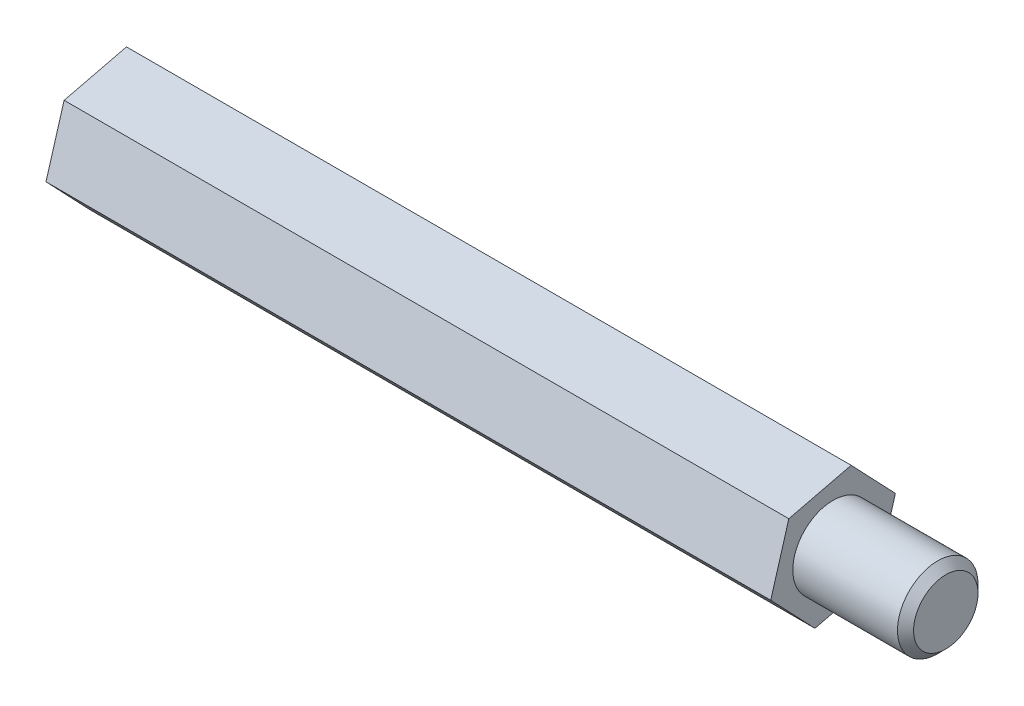
ISO-10303-21;
HEADER;
FILE_DESCRIPTION(('STEP AP214'),'2;1');
FILE_NAME('part.step','',(''),(''),'','','');
FILE_SCHEMA(('AUTOMOTIVE_DESIGN { 1 0 10303 214 1 1 1 1 }'));
ENDSEC;
DATA;
#1=APPLICATION_CONTEXT('core data for automotive mechanical design processes');
#2=APPLICATION_PROTOCOL_DEFINITION('international standard','automotive_design',2000,#1);
#3=PRODUCT_CONTEXT('',#1,'mechanical');
#4=PRODUCT('Part','Part','',(#3));
#5=PRODUCT_RELATED_PRODUCT_CATEGORY('part','',(#4));
#6=PRODUCT_DEFINITION_FORMATION('','',#4);
#7=PRODUCT_DEFINITION_CONTEXT('part definition',#1,'design');
#8=PRODUCT_DEFINITION('design','',#6,#7);
#9=PRODUCT_DEFINITION_SHAPE('','',#8);
#10=(LENGTH_UNIT() NAMED_UNIT(*) SI_UNIT(.MILLI.,.METRE.));
#11=(NAMED_UNIT(*) PLANE_ANGLE_UNIT() SI_UNIT($,.RADIAN.));
#12=(NAMED_UNIT(*) SI_UNIT($,.STERADIAN.) SOLID_ANGLE_UNIT());
#13=UNCERTAINTY_MEASURE_WITH_UNIT(LENGTH_MEASURE(1.E-05),#10,'distance_accuracy_value','');
#14=(GEOMETRIC_REPRESENTATION_CONTEXT(3) GLOBAL_UNCERTAINTY_ASSIGNED_CONTEXT((#13)) GLOBAL_UNIT_ASSIGNED_CONTEXT((#10,
#11,#12)) REPRESENTATION_CONTEXT('',''));
#15=CARTESIAN_POINT('',(0.,0.,0.));
#16=DIRECTION('',(0.,0.,1.));
#17=DIRECTION('',(1.,0.,0.));
#18=AXIS2_PLACEMENT_3D('',#15,#16,#17);
#19=CARTESIAN_POINT('',(45.,-3.82165678707494,1.12469524841357));
#20=DIRECTION('',(0.,0.971956498152784,0.235160723120545));
#21=DIRECTION('',(0.,-0.235160723120545,0.971956498152784));
#22=AXIS2_PLACEMENT_3D('',#19,#20,#21);
#23=PLANE('',#22);
#24=DIRECTION('',(0.,0.235160723120545,-0.971956498152784));
#25=VECTOR('',#24,1.);
#26=CARTESIAN_POINT('',(0.,-3.82165678707494,1.12469524841357));
#27=LINE('',#26,#25);
#28=CARTESIAN_POINT('',(0.,-3.82165678707494,1.12469524841357));
#29=VERTEX_POINT('',#28);
#30=CARTESIAN_POINT('',(0.,-2.88484305017927,-2.74730423794533));
#31=VERTEX_POINT('',#30);
#32=EDGE_CURVE('E124',#29,#31,#27,.T.);
#33=ORIENTED_EDGE('',*,*,#32,.T.);
#34=DIRECTION('',(-1.,0.,0.));
#35=VECTOR('',#34,1.);
#36=CARTESIAN_POINT('',(45.,-2.88484305017927,-2.74730423794533));
#37=LINE('',#36,#35);
#38=CARTESIAN_POINT('',(45.,-2.88484305017927,-2.74730423794533));
#39=VERTEX_POINT('',#38);
#40=EDGE_CURVE('E142',#39,#31,#37,.T.);
#41=ORIENTED_EDGE('',*,*,#40,.F.);
#42=DIRECTION('',(0.,0.235160723120545,-0.971956498152784));
#43=VECTOR('',#42,1.);
#44=CARTESIAN_POINT('',(45.,-3.82165678707494,1.12469524841357));
#45=LINE('',#44,#43);
#46=CARTESIAN_POINT('',(45.,-3.82165678707494,1.12469524841357));
#47=VERTEX_POINT('',#46);
#48=EDGE_CURVE('E135',#47,#39,#45,.T.);
#49=ORIENTED_EDGE('',*,*,#48,.F.);
#50=DIRECTION('',(-1.,0.,0.));
#51=VECTOR('',#50,1.);
#52=CARTESIAN_POINT('',(45.,-3.82165678707494,1.12469524841357));
#53=LINE('',#52,#51);
#54=EDGE_CURVE('E120',#47,#29,#53,.T.);
#55=ORIENTED_EDGE('',*,*,#54,.T.);
#56=EDGE_LOOP('',(#33,#41,#49,#55));
#57=FACE_BOUND('',#56,.T.);
#58=ADVANCED_FACE('F37',(#57),#23,.F.);
#59=CARTESIAN_POINT('',(45.,-2.88484305017927,-2.74730423794533));
#60=DIRECTION('',(0.,0.282323088881682,0.959319380333946));
#61=DIRECTION('',(0.,-0.959319380333946,0.282323088881682));
#62=AXIS2_PLACEMENT_3D('',#59,#60,#61);
#63=PLANE('',#62);
#64=DIRECTION('',(0.,0.959319380333946,-0.282323088881682));
#65=VECTOR('',#64,1.);
#66=CARTESIAN_POINT('',(0.,-2.88484305017927,-2.74730423794533));
#67=LINE('',#66,#65);
#68=CARTESIAN_POINT('',(0.,0.936813736895666,-3.8719994863589));
#69=VERTEX_POINT('',#68);
#70=EDGE_CURVE('E127',#31,#69,#67,.T.);
#71=ORIENTED_EDGE('',*,*,#70,.T.);
#72=DIRECTION('',(-1.,0.,0.));
#73=VECTOR('',#72,1.);
#74=CARTESIAN_POINT('',(45.,0.936813736895666,-3.8719994863589));
#75=LINE('',#74,#73);
#76=CARTESIAN_POINT('',(45.,0.936813736895666,-3.8719994863589));
#77=VERTEX_POINT('',#76);
#78=EDGE_CURVE('E139',#77,#69,#75,.T.);
#79=ORIENTED_EDGE('',*,*,#78,.F.);
#80=DIRECTION('',(0.,0.959319380333946,-0.282323088881682));
#81=VECTOR('',#80,1.);
#82=CARTESIAN_POINT('',(45.,-2.88484305017927,-2.74730423794533));
#83=LINE('',#82,#81);
#84=EDGE_CURVE('E93',#39,#77,#83,.T.);
#85=ORIENTED_EDGE('',*,*,#84,.F.);
#86=ORIENTED_EDGE('',*,*,#40,.T.);
#87=EDGE_LOOP('',(#71,#79,#85,#86));
#88=FACE_BOUND('',#87,.T.);
#89=ADVANCED_FACE('F158',(#88),#63,.F.);
#90=CARTESIAN_POINT('',(45.,0.936813736895666,-3.8719994863589));
#91=DIRECTION('',(0.,-0.689633409271102,0.724158657213402));
#92=DIRECTION('',(0.,-0.724158657213402,-0.689633409271102));
#93=AXIS2_PLACEMENT_3D('',#90,#91,#92);
#94=PLANE('',#93);
#95=DIRECTION('',(0.,0.724158657213402,0.689633409271102));
#96=VECTOR('',#95,1.);
#97=CARTESIAN_POINT('',(0.,0.936813736895666,-3.8719994863589));
#98=LINE('',#97,#96);
#99=CARTESIAN_POINT('',(0.,3.82165678707494,-1.12469524841357));
#100=VERTEX_POINT('',#99);
#101=EDGE_CURVE('E130',#69,#100,#98,.T.);
#102=ORIENTED_EDGE('',*,*,#101,.T.);
#103=DIRECTION('',(-1.,0.,0.));
#104=VECTOR('',#103,1.);
#105=CARTESIAN_POINT('',(45.,3.82165678707494,-1.12469524841357));
#106=LINE('',#105,#104);
#107=CARTESIAN_POINT('',(45.,3.82165678707494,-1.12469524841357));
#108=VERTEX_POINT('',#107);
#109=EDGE_CURVE('E115',#108,#100,#106,.T.);
#110=ORIENTED_EDGE('',*,*,#109,.F.);
#111=DIRECTION('',(0.,0.724158657213402,0.689633409271102));
#112=VECTOR('',#111,1.);
#113=CARTESIAN_POINT('',(45.,0.936813736895666,-3.8719994863589));
#114=LINE('',#113,#112);
#115=EDGE_CURVE('E106',#77,#108,#114,.T.);
#116=ORIENTED_EDGE('',*,*,#115,.F.);
#117=ORIENTED_EDGE('',*,*,#78,.T.);
#118=EDGE_LOOP('',(#102,#110,#116,#117));
#119=FACE_BOUND('',#118,.T.);
#120=ADVANCED_FACE('F161',(#119),#94,.F.);
#121=CARTESIAN_POINT('',(45.,3.82165678707494,-1.12469524841357));
#122=DIRECTION('',(0.,-0.971956498152784,-0.235160723120544));
#123=DIRECTION('',(0.,0.235160723120544,-0.971956498152784));
#124=AXIS2_PLACEMENT_3D('',#121,#122,#123);
#125=PLANE('',#124);
#126=DIRECTION('',(0.,-0.235160723120544,0.971956498152784));
#127=VECTOR('',#126,1.);
#128=CARTESIAN_POINT('',(0.,3.82165678707494,-1.12469524841357));
#129=LINE('',#128,#127);
#130=CARTESIAN_POINT('',(0.,2.88484305017927,2.74730423794533));
#131=VERTEX_POINT('',#130);
#132=EDGE_CURVE('E114',#100,#131,#129,.T.);
#133=ORIENTED_EDGE('',*,*,#132,.T.);
#134=DIRECTION('',(-1.,0.,0.));
#135=VECTOR('',#134,1.);
#136=CARTESIAN_POINT('',(45.,2.88484305017927,2.74730423794533));
#137=LINE('',#136,#135);
#138=CARTESIAN_POINT('',(45.,2.88484305017927,2.74730423794533));
#139=VERTEX_POINT('',#138);
#140=EDGE_CURVE('E111',#139,#131,#137,.T.);
#141=ORIENTED_EDGE('',*,*,#140,.F.);
#142=DIRECTION('',(0.,-0.235160723120544,0.971956498152784));
#143=VECTOR('',#142,1.);
#144=CARTESIAN_POINT('',(45.,3.82165678707494,-1.12469524841357));
#145=LINE('',#144,#143);
#146=EDGE_CURVE('E100',#108,#139,#145,.T.);
#147=ORIENTED_EDGE('',*,*,#146,.F.);
#148=ORIENTED_EDGE('',*,*,#109,.T.);
#149=EDGE_LOOP('',(#133,#141,#147,#148));
#150=FACE_BOUND('',#149,.T.);
#151=ADVANCED_FACE('F112',(#150),#125,.F.);
#152=CARTESIAN_POINT('',(45.,2.88484305017927,2.74730423794533));
#153=DIRECTION('',(0.,-0.282323088881682,-0.959319380333946));
#154=DIRECTION('',(0.,0.959319380333946,-0.282323088881682));
#155=AXIS2_PLACEMENT_3D('',#152,#153,#154);
#156=PLANE('',#155);
#157=DIRECTION('',(0.,-0.959319380333946,0.282323088881682));
#158=VECTOR('',#157,1.);
#159=CARTESIAN_POINT('',(0.,2.88484305017927,2.74730423794533));
#160=LINE('',#159,#158);
#161=CARTESIAN_POINT('',(0.,-0.936813736895665,3.8719994863589));
#162=VERTEX_POINT('',#161);
#163=EDGE_CURVE('E78',#131,#162,#160,.T.);
#164=ORIENTED_EDGE('',*,*,#163,.T.);
#165=DIRECTION('',(-1.,0.,0.));
#166=VECTOR('',#165,1.);
#167=CARTESIAN_POINT('',(45.,-0.936813736895665,3.8719994863589));
#168=LINE('',#167,#166);
#169=CARTESIAN_POINT('',(45.,-0.936813736895665,3.8719994863589));
#170=VERTEX_POINT('',#169);
#171=EDGE_CURVE('E116',#170,#162,#168,.T.);
#172=ORIENTED_EDGE('',*,*,#171,.F.);
#173=DIRECTION('',(0.,-0.959319380333946,0.282323088881682));
#174=VECTOR('',#173,1.);
#175=CARTESIAN_POINT('',(45.,2.88484305017927,2.74730423794533));
#176=LINE('',#175,#174);
#177=EDGE_CURVE('E104',#139,#170,#176,.T.);
#178=ORIENTED_EDGE('',*,*,#177,.F.);
#179=ORIENTED_EDGE('',*,*,#140,.T.);
#180=EDGE_LOOP('',(#164,#172,#178,#179));
#181=FACE_BOUND('',#180,.T.);
#182=ADVANCED_FACE('F118',(#181),#156,.F.);
#183=CARTESIAN_POINT('',(45.,-0.936813736895665,3.8719994863589));
#184=DIRECTION('',(0.,0.689633409271102,-0.724158657213402));
#185=DIRECTION('',(0.,0.724158657213402,0.689633409271102));
#186=AXIS2_PLACEMENT_3D('',#183,#184,#185);
#187=PLANE('',#186);
#188=DIRECTION('',(0.,-0.724158657213402,-0.689633409271102));
#189=VECTOR('',#188,1.);
#190=CARTESIAN_POINT('',(0.,-0.936813736895665,3.8719994863589));
#191=LINE('',#190,#189);
#192=EDGE_CURVE('E84',#162,#29,#191,.T.);
#193=ORIENTED_EDGE('',*,*,#192,.T.);
#194=ORIENTED_EDGE('',*,*,#54,.F.);
#195=DIRECTION('',(0.,-0.724158657213402,-0.689633409271102));
#196=VECTOR('',#195,1.);
#197=CARTESIAN_POINT('',(45.,-0.936813736895665,3.8719994863589));
#198=LINE('',#197,#196);
#199=EDGE_CURVE('E55',#170,#47,#198,.T.);
#200=ORIENTED_EDGE('',*,*,#199,.F.);
#201=ORIENTED_EDGE('',*,*,#171,.T.);
#202=EDGE_LOOP('',(#193,#194,#200,#201));
#203=FACE_BOUND('',#202,.T.);
#204=ADVANCED_FACE('F166',(#203),#187,.F.);
#205=CARTESIAN_POINT('',(45.,0.,0.));
#206=DIRECTION('',(1.,0.,0.));
#207=DIRECTION('',(0.,0.,-1.));
#208=AXIS2_PLACEMENT_3D('',#205,#206,#207);
#209=PLANE('',#208);
#210=CARTESIAN_POINT('',(45.,0.,0.));
#211=DIRECTION('',(1.,0.,0.));
#212=DIRECTION('',(0.,0.,-1.));
#213=AXIS2_PLACEMENT_3D('',#210,#211,#212);
#214=CIRCLE('',#213,2.5);
#215=CARTESIAN_POINT('',(45.,0.,-2.5));
#216=VERTEX_POINT('',#215);
#217=EDGE_CURVE('E143',#216,#216,#214,.T.);
#218=ORIENTED_EDGE('',*,*,#217,.F.);
#219=EDGE_LOOP('',(#218));
#220=FACE_BOUND('',#219,.T.);
#221=ORIENTED_EDGE('',*,*,#48,.T.);
#222=ORIENTED_EDGE('',*,*,#84,.T.);
#223=ORIENTED_EDGE('',*,*,#115,.T.);
#224=ORIENTED_EDGE('',*,*,#146,.T.);
#225=ORIENTED_EDGE('',*,*,#177,.T.);
#226=ORIENTED_EDGE('',*,*,#199,.T.);
#227=EDGE_LOOP('',(#221,#222,#223,#224,#225,#226));
#228=FACE_BOUND('',#227,.T.);
#229=ADVANCED_FACE('F102',(#220,#228),#209,.T.);
#230=CARTESIAN_POINT('',(0.,0.,0.));
#231=DIRECTION('',(1.,0.,0.));
#232=DIRECTION('',(0.,0.,-1.));
#233=AXIS2_PLACEMENT_3D('',#230,#231,#232);
#234=PLANE('',#233);
#235=CARTESIAN_POINT('',(0.,0.,0.));
#236=DIRECTION('',(-1.,0.,0.));
#237=DIRECTION('',(0.,0.,1.));
#238=AXIS2_PLACEMENT_3D('',#235,#236,#237);
#239=CIRCLE('',#238,2.5);
#240=CARTESIAN_POINT('',(0.,0.,2.5));
#241=VERTEX_POINT('',#240);
#242=EDGE_CURVE('E153',#241,#241,#239,.T.);
#243=ORIENTED_EDGE('',*,*,#242,.F.);
#244=EDGE_LOOP('',(#243));
#245=FACE_BOUND('',#244,.T.);
#246=ORIENTED_EDGE('',*,*,#32,.F.);
#247=ORIENTED_EDGE('',*,*,#192,.F.);
#248=ORIENTED_EDGE('',*,*,#163,.F.);
#249=ORIENTED_EDGE('',*,*,#132,.F.);
#250=ORIENTED_EDGE('',*,*,#101,.F.);
#251=ORIENTED_EDGE('',*,*,#70,.F.);
#252=EDGE_LOOP('',(#246,#247,#248,#249,#250,#251));
#253=FACE_BOUND('',#252,.T.);
#254=ADVANCED_FACE('F164',(#245,#253),#234,.F.);
#255=CARTESIAN_POINT('',(52.,0.,0.));
#256=DIRECTION('',(-1.,0.,0.));
#257=DIRECTION('',(0.,0.,1.));
#258=AXIS2_PLACEMENT_3D('',#255,#256,#257);
#259=CYLINDRICAL_SURFACE('',#258,2.5);
#260=CARTESIAN_POINT('',(51.5,0.,0.));
#261=DIRECTION('',(1.,0.,0.));
#262=DIRECTION('',(0.,0.,-1.));
#263=AXIS2_PLACEMENT_3D('',#260,#261,#262);
#264=CIRCLE('',#263,2.5);
#265=CARTESIAN_POINT('',(51.5,0.,-2.5));
#266=VERTEX_POINT('',#265);
#267=EDGE_CURVE('E11',#266,#266,#264,.F.);
#268=ORIENTED_EDGE('',*,*,#267,.T.);
#269=EDGE_LOOP('',(#268));
#270=FACE_BOUND('',#269,.T.);
#271=ORIENTED_EDGE('',*,*,#217,.T.);
#272=EDGE_LOOP('',(#271));
#273=FACE_BOUND('',#272,.T.);
#274=ADVANCED_FACE('F211',(#270,#273),#259,.T.);
#275=CARTESIAN_POINT('',(52.,0.,0.));
#276=DIRECTION('',(1.,0.,0.));
#277=DIRECTION('',(0.,0.,-1.));
#278=AXIS2_PLACEMENT_3D('',#275,#276,#277);
#279=PLANE('',#278);
#280=CARTESIAN_POINT('',(52.,0.,0.));
#281=DIRECTION('',(1.,0.,0.));
#282=DIRECTION('',(0.,0.,-1.));
#283=AXIS2_PLACEMENT_3D('',#280,#281,#282);
#284=CIRCLE('',#283,1.99999999999999);
#285=CARTESIAN_POINT('',(52.,0.,-1.99999999999999));
#286=VERTEX_POINT('',#285);
#287=EDGE_CURVE('E47',#286,#286,#284,.T.);
#288=ORIENTED_EDGE('',*,*,#287,.T.);
#289=EDGE_LOOP('',(#288));
#290=FACE_BOUND('',#289,.T.);
#291=ADVANCED_FACE('F216',(#290),#279,.T.);
#292=CARTESIAN_POINT('',(52.,0.,0.));
#293=DIRECTION('',(-1.,0.,0.));
#294=DIRECTION('',(0.,0.,1.));
#295=AXIS2_PLACEMENT_3D('',#292,#293,#294);
#296=CONICAL_SURFACE('',#295,1.99999999999999,0.785398163397446);
#297=ORIENTED_EDGE('',*,*,#267,.F.);
#298=EDGE_LOOP('',(#297));
#299=FACE_BOUND('',#298,.T.);
#300=ORIENTED_EDGE('',*,*,#287,.F.);
#301=EDGE_LOOP('',(#300));
#302=FACE_BOUND('',#301,.T.);
#303=ADVANCED_FACE('F40',(#299,#302),#296,.T.);
#304=CARTESIAN_POINT('',(7.,0.,0.));
#305=DIRECTION('',(-1.,0.,0.));
#306=DIRECTION('',(0.,0.,1.));
#307=AXIS2_PLACEMENT_3D('',#304,#305,#306);
#308=CYLINDRICAL_SURFACE('',#307,2.5);
#309=CARTESIAN_POINT('',(7.,0.,0.));
#310=DIRECTION('',(-1.,0.,0.));
#311=DIRECTION('',(0.,0.,1.));
#312=AXIS2_PLACEMENT_3D('',#309,#310,#311);
#313=CIRCLE('',#312,2.5);
#314=CARTESIAN_POINT('',(7.,0.,2.5));
#315=VERTEX_POINT('',#314);
#316=EDGE_CURVE('E128',#315,#315,#313,.T.);
#317=ORIENTED_EDGE('',*,*,#316,.F.);
#318=EDGE_LOOP('',(#317));
#319=FACE_BOUND('',#318,.T.);
#320=ORIENTED_EDGE('',*,*,#242,.T.);
#321=EDGE_LOOP('',(#320));
#322=FACE_BOUND('',#321,.T.);
#323=ADVANCED_FACE('F234',(#319,#322),#308,.F.);
#324=CARTESIAN_POINT('',(7.,0.,0.));
#325=DIRECTION('',(-1.,0.,0.));
#326=DIRECTION('',(0.,0.,1.));
#327=AXIS2_PLACEMENT_3D('',#324,#325,#326);
#328=PLANE('',#327);
#329=ORIENTED_EDGE('',*,*,#316,.T.);
#330=EDGE_LOOP('',(#329));
#331=FACE_BOUND('',#330,.T.);
#332=ADVANCED_FACE('F249',(#331),#328,.T.);
#333=CLOSED_SHELL('',(#58,#89,#120,#151,#182,#204,#229,#254,#274,#291,#303,#323,#332));
#334=MANIFOLD_SOLID_BREP('B2',#333);
#335=ADVANCED_BREP_SHAPE_REPRESENTATION('',(#18,#334),#14);
#336=SHAPE_DEFINITION_REPRESENTATION(#9,#335);
ENDSEC;
END-ISO-10303-21;
